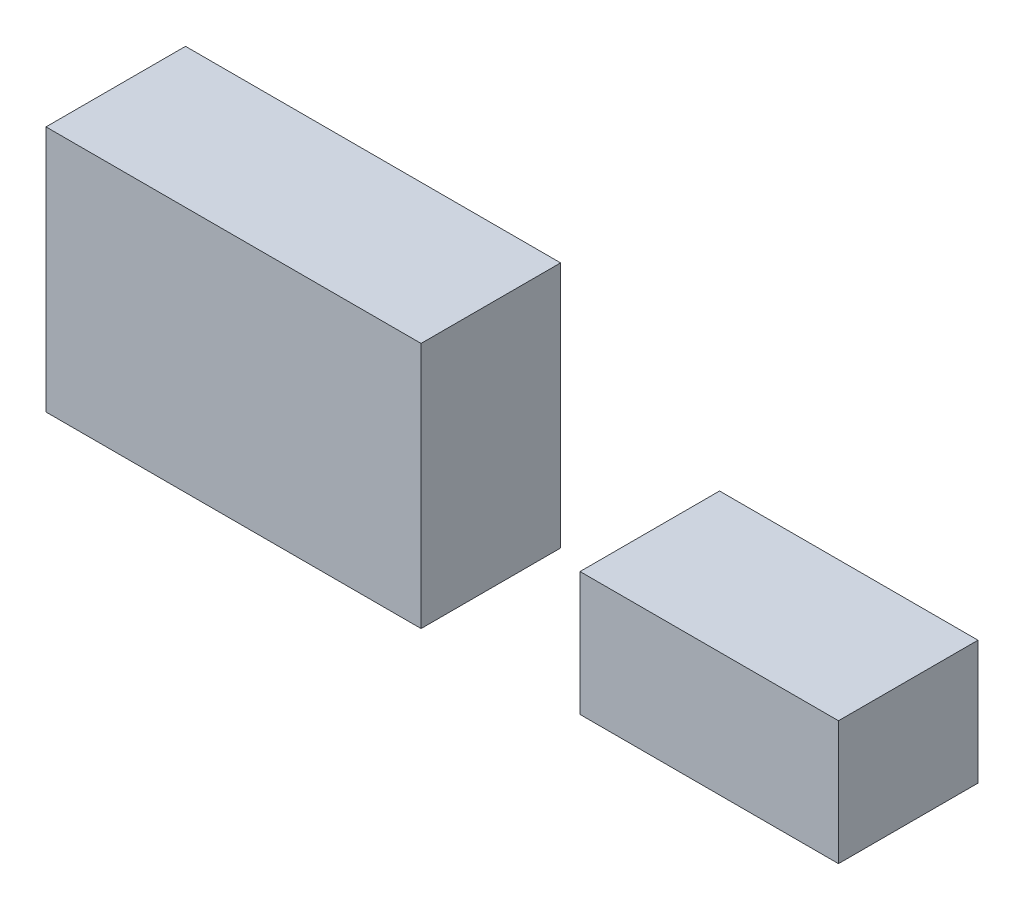
ISO-10303-21;
HEADER;
FILE_DESCRIPTION(('STEP AP214'),'2;1');
FILE_NAME('part.step','',(''),(''),'','','');
FILE_SCHEMA(('AUTOMOTIVE_DESIGN { 1 0 10303 214 1 1 1 1 }'));
ENDSEC;
DATA;
#1=APPLICATION_CONTEXT('core data for automotive mechanical design processes');
#2=APPLICATION_PROTOCOL_DEFINITION('international standard','automotive_design',2000,#1);
#3=PRODUCT_CONTEXT('',#1,'mechanical');
#4=PRODUCT('Part','Part','',(#3));
#5=PRODUCT_RELATED_PRODUCT_CATEGORY('part','',(#4));
#6=PRODUCT_DEFINITION_FORMATION('','',#4);
#7=PRODUCT_DEFINITION_CONTEXT('part definition',#1,'design');
#8=PRODUCT_DEFINITION('design','',#6,#7);
#9=PRODUCT_DEFINITION_SHAPE('','',#8);
#10=(LENGTH_UNIT() NAMED_UNIT(*) SI_UNIT(.MILLI.,.METRE.));
#11=(NAMED_UNIT(*) PLANE_ANGLE_UNIT() SI_UNIT($,.RADIAN.));
#12=(NAMED_UNIT(*) SI_UNIT($,.STERADIAN.) SOLID_ANGLE_UNIT());
#13=UNCERTAINTY_MEASURE_WITH_UNIT(LENGTH_MEASURE(1.E-05),#10,'distance_accuracy_value','');
#14=(GEOMETRIC_REPRESENTATION_CONTEXT(3) GLOBAL_UNCERTAINTY_ASSIGNED_CONTEXT((#13)) GLOBAL_UNIT_ASSIGNED_CONTEXT((#10,
#11,#12)) REPRESENTATION_CONTEXT('',''));
#15=CARTESIAN_POINT('',(0.,0.,0.));
#16=DIRECTION('',(0.,0.,1.));
#17=DIRECTION('',(1.,0.,0.));
#18=AXIS2_PLACEMENT_3D('',#15,#16,#17);
#19=CARTESIAN_POINT('',(95.8766550097607,23.2414784676962,62.));
#20=DIRECTION('',(1.,0.,0.));
#21=DIRECTION('',(0.,0.,-1.));
#22=AXIS2_PLACEMENT_3D('',#19,#20,#21);
#23=PLANE('',#22);
#24=DIRECTION('',(0.,-1.,0.));
#25=VECTOR('',#24,1.);
#26=CARTESIAN_POINT('',(95.8766550097607,23.2414784676962,0.));
#27=LINE('',#26,#25);
#28=CARTESIAN_POINT('',(95.8766550097607,23.2414784676962,0.));
#29=VERTEX_POINT('',#28);
#30=CARTESIAN_POINT('',(95.8766550097607,-31.770905661233,0.));
#31=VERTEX_POINT('',#30);
#32=EDGE_CURVE('E108',#29,#31,#27,.T.);
#33=ORIENTED_EDGE('',*,*,#32,.T.);
#34=DIRECTION('',(0.,0.,-1.));
#35=VECTOR('',#34,1.);
#36=CARTESIAN_POINT('',(95.8766550097607,-31.770905661233,62.));
#37=LINE('',#36,#35);
#38=CARTESIAN_POINT('',(95.8766550097607,-31.770905661233,62.));
#39=VERTEX_POINT('',#38);
#40=EDGE_CURVE('E12',#39,#31,#37,.T.);
#41=ORIENTED_EDGE('',*,*,#40,.F.);
#42=DIRECTION('',(0.,-1.,0.));
#43=VECTOR('',#42,1.);
#44=CARTESIAN_POINT('',(95.8766550097607,23.2414784676962,62.));
#45=LINE('',#44,#43);
#46=CARTESIAN_POINT('',(95.8766550097607,23.2414784676962,62.));
#47=VERTEX_POINT('',#46);
#48=EDGE_CURVE('E96',#47,#39,#45,.T.);
#49=ORIENTED_EDGE('',*,*,#48,.F.);
#50=DIRECTION('',(0.,0.,-1.));
#51=VECTOR('',#50,1.);
#52=CARTESIAN_POINT('',(95.8766550097607,23.2414784676962,62.));
#53=LINE('',#52,#51);
#54=EDGE_CURVE('E104',#47,#29,#53,.T.);
#55=ORIENTED_EDGE('',*,*,#54,.T.);
#56=EDGE_LOOP('',(#33,#41,#49,#55));
#57=FACE_BOUND('',#56,.T.);
#58=ADVANCED_FACE('F45',(#57),#23,.F.);
#59=CARTESIAN_POINT('',(95.8766550097607,-31.770905661233,62.));
#60=DIRECTION('',(0.,1.,0.));
#61=DIRECTION('',(0.,0.,1.));
#62=AXIS2_PLACEMENT_3D('',#59,#60,#61);
#63=PLANE('',#62);
#64=DIRECTION('',(1.,0.,0.));
#65=VECTOR('',#64,1.);
#66=CARTESIAN_POINT('',(95.8766550097607,-31.770905661233,0.));
#67=LINE('',#66,#65);
#68=CARTESIAN_POINT('',(210.729893845269,-31.770905661233,0.));
#69=VERTEX_POINT('',#68);
#70=EDGE_CURVE('E100',#31,#69,#67,.T.);
#71=ORIENTED_EDGE('',*,*,#70,.T.);
#72=DIRECTION('',(0.,0.,-1.));
#73=VECTOR('',#72,1.);
#74=CARTESIAN_POINT('',(210.729893845269,-31.770905661233,62.));
#75=LINE('',#74,#73);
#76=CARTESIAN_POINT('',(210.729893845269,-31.770905661233,62.));
#77=VERTEX_POINT('',#76);
#78=EDGE_CURVE('E53',#77,#69,#75,.T.);
#79=ORIENTED_EDGE('',*,*,#78,.F.);
#80=DIRECTION('',(1.,0.,0.));
#81=VECTOR('',#80,1.);
#82=CARTESIAN_POINT('',(95.8766550097607,-31.770905661233,62.));
#83=LINE('',#82,#81);
#84=EDGE_CURVE('E91',#39,#77,#83,.T.);
#85=ORIENTED_EDGE('',*,*,#84,.F.);
#86=ORIENTED_EDGE('',*,*,#40,.T.);
#87=EDGE_LOOP('',(#71,#79,#85,#86));
#88=FACE_BOUND('',#87,.T.);
#89=ADVANCED_FACE('F99',(#88),#63,.F.);
#90=CARTESIAN_POINT('',(210.729893845269,23.2414784676962,62.));
#91=DIRECTION('',(-1.,0.,0.));
#92=DIRECTION('',(0.,0.,1.));
#93=AXIS2_PLACEMENT_3D('',#90,#91,#92);
#94=PLANE('',#93);
#95=DIRECTION('',(0.,1.,0.));
#96=VECTOR('',#95,1.);
#97=CARTESIAN_POINT('',(210.729893845269,23.2414784676962,0.));
#98=LINE('',#97,#96);
#99=CARTESIAN_POINT('',(210.729893845269,23.2414784676962,0.));
#100=VERTEX_POINT('',#99);
#101=EDGE_CURVE('E78',#69,#100,#98,.T.);
#102=ORIENTED_EDGE('',*,*,#101,.T.);
#103=DIRECTION('',(0.,0.,-1.));
#104=VECTOR('',#103,1.);
#105=CARTESIAN_POINT('',(210.729893845269,23.2414784676962,62.));
#106=LINE('',#105,#104);
#107=CARTESIAN_POINT('',(210.729893845269,23.2414784676962,62.));
#108=VERTEX_POINT('',#107);
#109=EDGE_CURVE('E101',#108,#100,#106,.T.);
#110=ORIENTED_EDGE('',*,*,#109,.F.);
#111=DIRECTION('',(0.,1.,0.));
#112=VECTOR('',#111,1.);
#113=CARTESIAN_POINT('',(210.729893845269,23.2414784676962,62.));
#114=LINE('',#113,#112);
#115=EDGE_CURVE('E94',#77,#108,#114,.T.);
#116=ORIENTED_EDGE('',*,*,#115,.F.);
#117=ORIENTED_EDGE('',*,*,#78,.T.);
#118=EDGE_LOOP('',(#102,#110,#116,#117));
#119=FACE_BOUND('',#118,.T.);
#120=ADVANCED_FACE('F102',(#119),#94,.F.);
#121=CARTESIAN_POINT('',(95.8766550097607,23.2414784676962,62.));
#122=DIRECTION('',(0.,-1.,0.));
#123=DIRECTION('',(0.,0.,-1.));
#124=AXIS2_PLACEMENT_3D('',#121,#122,#123);
#125=PLANE('',#124);
#126=DIRECTION('',(-1.,0.,0.));
#127=VECTOR('',#126,1.);
#128=CARTESIAN_POINT('',(95.8766550097607,23.2414784676962,0.));
#129=LINE('',#128,#127);
#130=EDGE_CURVE('E84',#100,#29,#129,.T.);
#131=ORIENTED_EDGE('',*,*,#130,.T.);
#132=ORIENTED_EDGE('',*,*,#54,.F.);
#133=DIRECTION('',(-1.,0.,0.));
#134=VECTOR('',#133,1.);
#135=CARTESIAN_POINT('',(95.8766550097607,23.2414784676962,62.));
#136=LINE('',#135,#134);
#137=EDGE_CURVE('E61',#108,#47,#136,.T.);
#138=ORIENTED_EDGE('',*,*,#137,.F.);
#139=ORIENTED_EDGE('',*,*,#109,.T.);
#140=EDGE_LOOP('',(#131,#132,#138,#139));
#141=FACE_BOUND('',#140,.T.);
#142=ADVANCED_FACE('F115',(#141),#125,.F.);
#143=CARTESIAN_POINT('',(0.,0.,62.));
#144=DIRECTION('',(0.,0.,1.));
#145=DIRECTION('',(1.,0.,0.));
#146=AXIS2_PLACEMENT_3D('',#143,#144,#145);
#147=PLANE('',#146);
#148=ORIENTED_EDGE('',*,*,#48,.T.);
#149=ORIENTED_EDGE('',*,*,#84,.T.);
#150=ORIENTED_EDGE('',*,*,#115,.T.);
#151=ORIENTED_EDGE('',*,*,#137,.T.);
#152=EDGE_LOOP('',(#148,#149,#150,#151));
#153=FACE_BOUND('',#152,.T.);
#154=ADVANCED_FACE('F92',(#153),#147,.T.);
#155=CARTESIAN_POINT('',(0.,0.,0.));
#156=DIRECTION('',(0.,0.,1.));
#157=DIRECTION('',(1.,0.,0.));
#158=AXIS2_PLACEMENT_3D('',#155,#156,#157);
#159=PLANE('',#158);
#160=ORIENTED_EDGE('',*,*,#32,.F.);
#161=ORIENTED_EDGE('',*,*,#130,.F.);
#162=ORIENTED_EDGE('',*,*,#101,.F.);
#163=ORIENTED_EDGE('',*,*,#70,.F.);
#164=EDGE_LOOP('',(#160,#161,#162,#163));
#165=FACE_BOUND('',#164,.T.);
#166=ADVANCED_FACE('F118',(#165),#159,.F.);
#167=CLOSED_SHELL('',(#58,#89,#120,#142,#154,#166));
#168=MANIFOLD_SOLID_BREP('B2',#167);
#169=CARTESIAN_POINT('',(-141.443467445685,75.7104037364867,62.));
#170=DIRECTION('',(1.,0.,0.));
#171=DIRECTION('',(0.,0.,-1.));
#172=AXIS2_PLACEMENT_3D('',#169,#170,#171);
#173=PLANE('',#172);
#174=DIRECTION('',(0.,-1.,0.));
#175=VECTOR('',#174,1.);
#176=CARTESIAN_POINT('',(-141.443467445685,75.7104037364867,0.));
#177=LINE('',#176,#175);
#178=CARTESIAN_POINT('',(-141.443467445685,75.7104037364867,0.));
#179=VERTEX_POINT('',#178);
#180=CARTESIAN_POINT('',(-141.443467445685,-34.0403365636917,0.));
#181=VERTEX_POINT('',#180);
#182=EDGE_CURVE('E232',#179,#181,#177,.T.);
#183=ORIENTED_EDGE('',*,*,#182,.T.);
#184=DIRECTION('',(0.,0.,-1.));
#185=VECTOR('',#184,1.);
#186=CARTESIAN_POINT('',(-141.443467445685,-34.0403365636917,62.));
#187=LINE('',#186,#185);
#188=CARTESIAN_POINT('',(-141.443467445685,-34.0403365636917,62.));
#189=VERTEX_POINT('',#188);
#190=EDGE_CURVE('E43',#189,#181,#187,.T.);
#191=ORIENTED_EDGE('',*,*,#190,.F.);
#192=DIRECTION('',(0.,-1.,0.));
#193=VECTOR('',#192,1.);
#194=CARTESIAN_POINT('',(-141.443467445685,75.7104037364867,62.));
#195=LINE('',#194,#193);
#196=CARTESIAN_POINT('',(-141.443467445685,75.7104037364867,62.));
#197=VERTEX_POINT('',#196);
#198=EDGE_CURVE('E220',#197,#189,#195,.T.);
#199=ORIENTED_EDGE('',*,*,#198,.F.);
#200=DIRECTION('',(0.,0.,-1.));
#201=VECTOR('',#200,1.);
#202=CARTESIAN_POINT('',(-141.443467445685,75.7104037364867,62.));
#203=LINE('',#202,#201);
#204=EDGE_CURVE('E228',#197,#179,#203,.T.);
#205=ORIENTED_EDGE('',*,*,#204,.T.);
#206=EDGE_LOOP('',(#183,#191,#199,#205));
#207=FACE_BOUND('',#206,.T.);
#208=ADVANCED_FACE('F169',(#207),#173,.F.);
#209=CARTESIAN_POINT('',(-141.443467445685,-34.0403365636917,62.));
#210=DIRECTION('',(0.,1.,0.));
#211=DIRECTION('',(0.,0.,1.));
#212=AXIS2_PLACEMENT_3D('',#209,#210,#211);
#213=PLANE('',#212);
#214=DIRECTION('',(1.,0.,0.));
#215=VECTOR('',#214,1.);
#216=CARTESIAN_POINT('',(-141.443467445685,-34.0403365636917,0.));
#217=LINE('',#216,#215);
#218=CARTESIAN_POINT('',(25.2368012454956,-34.0403365636917,0.));
#219=VERTEX_POINT('',#218);
#220=EDGE_CURVE('E224',#181,#219,#217,.T.);
#221=ORIENTED_EDGE('',*,*,#220,.T.);
#222=DIRECTION('',(0.,0.,-1.));
#223=VECTOR('',#222,1.);
#224=CARTESIAN_POINT('',(25.2368012454956,-34.0403365636917,62.));
#225=LINE('',#224,#223);
#226=CARTESIAN_POINT('',(25.2368012454956,-34.0403365636917,62.));
#227=VERTEX_POINT('',#226);
#228=EDGE_CURVE('E177',#227,#219,#225,.T.);
#229=ORIENTED_EDGE('',*,*,#228,.F.);
#230=DIRECTION('',(1.,0.,0.));
#231=VECTOR('',#230,1.);
#232=CARTESIAN_POINT('',(-141.443467445685,-34.0403365636917,62.));
#233=LINE('',#232,#231);
#234=EDGE_CURVE('E215',#189,#227,#233,.T.);
#235=ORIENTED_EDGE('',*,*,#234,.F.);
#236=ORIENTED_EDGE('',*,*,#190,.T.);
#237=EDGE_LOOP('',(#221,#229,#235,#236));
#238=FACE_BOUND('',#237,.T.);
#239=ADVANCED_FACE('F223',(#238),#213,.F.);
#240=CARTESIAN_POINT('',(25.2368012454956,75.7104037364867,62.));
#241=DIRECTION('',(-1.,0.,0.));
#242=DIRECTION('',(0.,0.,1.));
#243=AXIS2_PLACEMENT_3D('',#240,#241,#242);
#244=PLANE('',#243);
#245=DIRECTION('',(0.,1.,0.));
#246=VECTOR('',#245,1.);
#247=CARTESIAN_POINT('',(25.2368012454956,75.7104037364867,0.));
#248=LINE('',#247,#246);
#249=CARTESIAN_POINT('',(25.2368012454956,75.7104037364867,0.));
#250=VERTEX_POINT('',#249);
#251=EDGE_CURVE('E202',#219,#250,#248,.T.);
#252=ORIENTED_EDGE('',*,*,#251,.T.);
#253=DIRECTION('',(0.,0.,-1.));
#254=VECTOR('',#253,1.);
#255=CARTESIAN_POINT('',(25.2368012454956,75.7104037364867,62.));
#256=LINE('',#255,#254);
#257=CARTESIAN_POINT('',(25.2368012454956,75.7104037364867,62.));
#258=VERTEX_POINT('',#257);
#259=EDGE_CURVE('E225',#258,#250,#256,.T.);
#260=ORIENTED_EDGE('',*,*,#259,.F.);
#261=DIRECTION('',(0.,1.,0.));
#262=VECTOR('',#261,1.);
#263=CARTESIAN_POINT('',(25.2368012454956,75.7104037364867,62.));
#264=LINE('',#263,#262);
#265=EDGE_CURVE('E218',#227,#258,#264,.T.);
#266=ORIENTED_EDGE('',*,*,#265,.F.);
#267=ORIENTED_EDGE('',*,*,#228,.T.);
#268=EDGE_LOOP('',(#252,#260,#266,#267));
#269=FACE_BOUND('',#268,.T.);
#270=ADVANCED_FACE('F226',(#269),#244,.F.);
#271=CARTESIAN_POINT('',(-141.443467445685,75.7104037364867,62.));
#272=DIRECTION('',(0.,-1.,0.));
#273=DIRECTION('',(0.,0.,-1.));
#274=AXIS2_PLACEMENT_3D('',#271,#272,#273);
#275=PLANE('',#274);
#276=DIRECTION('',(-1.,0.,0.));
#277=VECTOR('',#276,1.);
#278=CARTESIAN_POINT('',(-141.443467445685,75.7104037364867,0.));
#279=LINE('',#278,#277);
#280=EDGE_CURVE('E208',#250,#179,#279,.T.);
#281=ORIENTED_EDGE('',*,*,#280,.T.);
#282=ORIENTED_EDGE('',*,*,#204,.F.);
#283=DIRECTION('',(-1.,0.,0.));
#284=VECTOR('',#283,1.);
#285=CARTESIAN_POINT('',(-141.443467445685,75.7104037364867,62.));
#286=LINE('',#285,#284);
#287=EDGE_CURVE('E185',#258,#197,#286,.T.);
#288=ORIENTED_EDGE('',*,*,#287,.F.);
#289=ORIENTED_EDGE('',*,*,#259,.T.);
#290=EDGE_LOOP('',(#281,#282,#288,#289));
#291=FACE_BOUND('',#290,.T.);
#292=ADVANCED_FACE('F239',(#291),#275,.F.);
#293=CARTESIAN_POINT('',(0.,0.,62.));
#294=DIRECTION('',(0.,0.,1.));
#295=DIRECTION('',(1.,0.,0.));
#296=AXIS2_PLACEMENT_3D('',#293,#294,#295);
#297=PLANE('',#296);
#298=ORIENTED_EDGE('',*,*,#198,.T.);
#299=ORIENTED_EDGE('',*,*,#234,.T.);
#300=ORIENTED_EDGE('',*,*,#265,.T.);
#301=ORIENTED_EDGE('',*,*,#287,.T.);
#302=EDGE_LOOP('',(#298,#299,#300,#301));
#303=FACE_BOUND('',#302,.T.);
#304=ADVANCED_FACE('F216',(#303),#297,.T.);
#305=CARTESIAN_POINT('',(0.,0.,0.));
#306=DIRECTION('',(0.,0.,1.));
#307=DIRECTION('',(1.,0.,0.));
#308=AXIS2_PLACEMENT_3D('',#305,#306,#307);
#309=PLANE('',#308);
#310=ORIENTED_EDGE('',*,*,#182,.F.);
#311=ORIENTED_EDGE('',*,*,#280,.F.);
#312=ORIENTED_EDGE('',*,*,#251,.F.);
#313=ORIENTED_EDGE('',*,*,#220,.F.);
#314=EDGE_LOOP('',(#310,#311,#312,#313));
#315=FACE_BOUND('',#314,.T.);
#316=ADVANCED_FACE('F242',(#315),#309,.F.);
#317=CLOSED_SHELL('',(#208,#239,#270,#292,#304,#316));
#318=MANIFOLD_SOLID_BREP('B6',#317);
#319=ADVANCED_BREP_SHAPE_REPRESENTATION('',(#18,#168,#318),#14);
#320=SHAPE_DEFINITION_REPRESENTATION(#9,#319);
ENDSEC;
END-ISO-10303-21;
